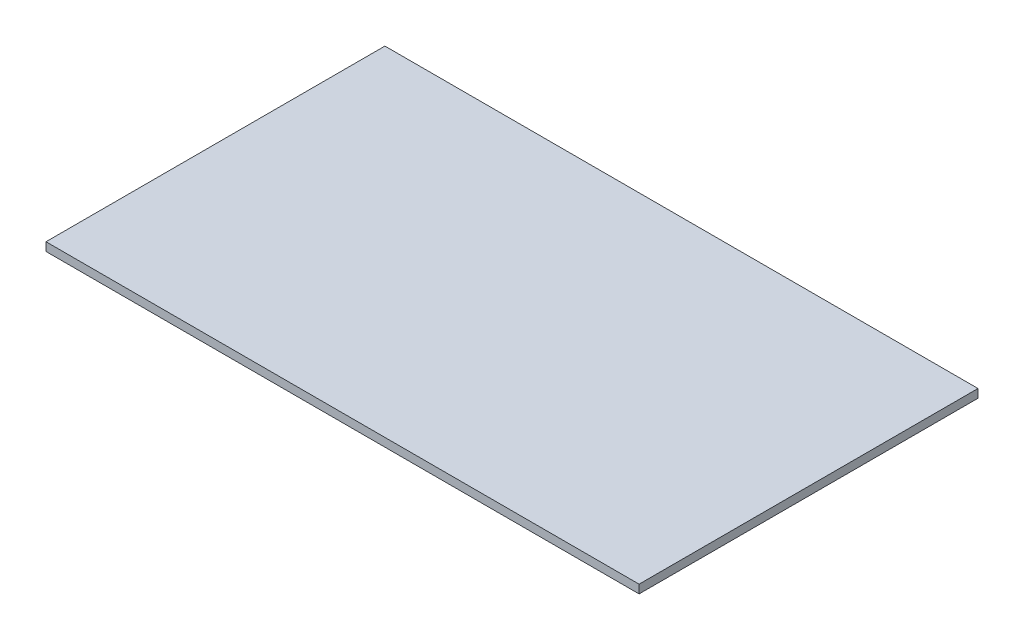
ISO-10303-21;
HEADER;
FILE_DESCRIPTION(('STEP AP214'),'2;1');
FILE_NAME('part.step','',(''),(''),'','','');
FILE_SCHEMA(('AUTOMOTIVE_DESIGN { 1 0 10303 214 1 1 1 1 }'));
ENDSEC;
DATA;
#1=APPLICATION_CONTEXT('core data for automotive mechanical design processes');
#2=APPLICATION_PROTOCOL_DEFINITION('international standard','automotive_design',2000,#1);
#3=PRODUCT_CONTEXT('',#1,'mechanical');
#4=PRODUCT('Part','Part','',(#3));
#5=PRODUCT_RELATED_PRODUCT_CATEGORY('part','',(#4));
#6=PRODUCT_DEFINITION_FORMATION('','',#4);
#7=PRODUCT_DEFINITION_CONTEXT('part definition',#1,'design');
#8=PRODUCT_DEFINITION('design','',#6,#7);
#9=PRODUCT_DEFINITION_SHAPE('','',#8);
#10=(LENGTH_UNIT() NAMED_UNIT(*) SI_UNIT(.MILLI.,.METRE.));
#11=(NAMED_UNIT(*) PLANE_ANGLE_UNIT() SI_UNIT($,.RADIAN.));
#12=(NAMED_UNIT(*) SI_UNIT($,.STERADIAN.) SOLID_ANGLE_UNIT());
#13=UNCERTAINTY_MEASURE_WITH_UNIT(LENGTH_MEASURE(1.E-05),#10,'distance_accuracy_value','');
#14=(GEOMETRIC_REPRESENTATION_CONTEXT(3) GLOBAL_UNCERTAINTY_ASSIGNED_CONTEXT((#13)) GLOBAL_UNIT_ASSIGNED_CONTEXT((#10,
#11,#12)) REPRESENTATION_CONTEXT('',''));
#15=CARTESIAN_POINT('',(0.,0.,0.));
#16=DIRECTION('',(0.,0.,1.));
#17=DIRECTION('',(1.,0.,0.));
#18=AXIS2_PLACEMENT_3D('',#15,#16,#17);
#19=CARTESIAN_POINT('',(-175.,5.,-100.));
#20=DIRECTION('',(1.,0.,0.));
#21=DIRECTION('',(0.,0.,-1.));
#22=AXIS2_PLACEMENT_3D('',#19,#20,#21);
#23=PLANE('',#22);
#24=DIRECTION('',(0.,0.,1.));
#25=VECTOR('',#24,1.);
#26=CARTESIAN_POINT('',(-175.,0.,-100.));
#27=LINE('',#26,#25);
#28=CARTESIAN_POINT('',(-175.,0.,-100.));
#29=VERTEX_POINT('',#28);
#30=CARTESIAN_POINT('',(-175.,0.,100.));
#31=VERTEX_POINT('',#30);
#32=EDGE_CURVE('E96',#29,#31,#27,.T.);
#33=ORIENTED_EDGE('',*,*,#32,.T.);
#34=DIRECTION('',(0.,-1.,0.));
#35=VECTOR('',#34,1.);
#36=CARTESIAN_POINT('',(-175.,5.,100.));
#37=LINE('',#36,#35);
#38=CARTESIAN_POINT('',(-175.,5.,100.));
#39=VERTEX_POINT('',#38);
#40=EDGE_CURVE('E11',#39,#31,#37,.T.);
#41=ORIENTED_EDGE('',*,*,#40,.F.);
#42=DIRECTION('',(0.,0.,1.));
#43=VECTOR('',#42,1.);
#44=CARTESIAN_POINT('',(-175.,5.,-100.));
#45=LINE('',#44,#43);
#46=CARTESIAN_POINT('',(-175.,5.,-100.));
#47=VERTEX_POINT('',#46);
#48=EDGE_CURVE('E84',#47,#39,#45,.T.);
#49=ORIENTED_EDGE('',*,*,#48,.F.);
#50=DIRECTION('',(0.,-1.,0.));
#51=VECTOR('',#50,1.);
#52=CARTESIAN_POINT('',(-175.,5.,-100.));
#53=LINE('',#52,#51);
#54=EDGE_CURVE('E92',#47,#29,#53,.T.);
#55=ORIENTED_EDGE('',*,*,#54,.T.);
#56=EDGE_LOOP('',(#33,#41,#49,#55));
#57=FACE_BOUND('',#56,.T.);
#58=ADVANCED_FACE('F33',(#57),#23,.F.);
#59=CARTESIAN_POINT('',(-175.,5.,100.));
#60=DIRECTION('',(0.,0.,-1.));
#61=DIRECTION('',(-1.,0.,0.));
#62=AXIS2_PLACEMENT_3D('',#59,#60,#61);
#63=PLANE('',#62);
#64=DIRECTION('',(1.,0.,0.));
#65=VECTOR('',#64,1.);
#66=CARTESIAN_POINT('',(-175.,0.,100.));
#67=LINE('',#66,#65);
#68=CARTESIAN_POINT('',(175.,0.,100.));
#69=VERTEX_POINT('',#68);
#70=EDGE_CURVE('E88',#31,#69,#67,.T.);
#71=ORIENTED_EDGE('',*,*,#70,.T.);
#72=DIRECTION('',(0.,-1.,0.));
#73=VECTOR('',#72,1.);
#74=CARTESIAN_POINT('',(175.,5.,100.));
#75=LINE('',#74,#73);
#76=CARTESIAN_POINT('',(175.,5.,100.));
#77=VERTEX_POINT('',#76);
#78=EDGE_CURVE('E41',#77,#69,#75,.T.);
#79=ORIENTED_EDGE('',*,*,#78,.F.);
#80=DIRECTION('',(1.,0.,0.));
#81=VECTOR('',#80,1.);
#82=CARTESIAN_POINT('',(-175.,5.,100.));
#83=LINE('',#82,#81);
#84=EDGE_CURVE('E79',#39,#77,#83,.T.);
#85=ORIENTED_EDGE('',*,*,#84,.F.);
#86=ORIENTED_EDGE('',*,*,#40,.T.);
#87=EDGE_LOOP('',(#71,#79,#85,#86));
#88=FACE_BOUND('',#87,.T.);
#89=ADVANCED_FACE('F87',(#88),#63,.F.);
#90=CARTESIAN_POINT('',(175.,5.,-100.));
#91=DIRECTION('',(-1.,0.,0.));
#92=DIRECTION('',(0.,0.,1.));
#93=AXIS2_PLACEMENT_3D('',#90,#91,#92);
#94=PLANE('',#93);
#95=DIRECTION('',(0.,0.,-1.));
#96=VECTOR('',#95,1.);
#97=CARTESIAN_POINT('',(175.,0.,-100.));
#98=LINE('',#97,#96);
#99=CARTESIAN_POINT('',(175.,0.,-100.));
#100=VERTEX_POINT('',#99);
#101=EDGE_CURVE('E66',#69,#100,#98,.T.);
#102=ORIENTED_EDGE('',*,*,#101,.T.);
#103=DIRECTION('',(0.,-1.,0.));
#104=VECTOR('',#103,1.);
#105=CARTESIAN_POINT('',(175.,5.,-100.));
#106=LINE('',#105,#104);
#107=CARTESIAN_POINT('',(175.,5.,-100.));
#108=VERTEX_POINT('',#107);
#109=EDGE_CURVE('E89',#108,#100,#106,.T.);
#110=ORIENTED_EDGE('',*,*,#109,.F.);
#111=DIRECTION('',(0.,0.,-1.));
#112=VECTOR('',#111,1.);
#113=CARTESIAN_POINT('',(175.,5.,-100.));
#114=LINE('',#113,#112);
#115=EDGE_CURVE('E82',#77,#108,#114,.T.);
#116=ORIENTED_EDGE('',*,*,#115,.F.);
#117=ORIENTED_EDGE('',*,*,#78,.T.);
#118=EDGE_LOOP('',(#102,#110,#116,#117));
#119=FACE_BOUND('',#118,.T.);
#120=ADVANCED_FACE('F90',(#119),#94,.F.);
#121=CARTESIAN_POINT('',(-175.,5.,-100.));
#122=DIRECTION('',(0.,0.,1.));
#123=DIRECTION('',(1.,0.,0.));
#124=AXIS2_PLACEMENT_3D('',#121,#122,#123);
#125=PLANE('',#124);
#126=DIRECTION('',(-1.,0.,0.));
#127=VECTOR('',#126,1.);
#128=CARTESIAN_POINT('',(-175.,0.,-100.));
#129=LINE('',#128,#127);
#130=EDGE_CURVE('E72',#100,#29,#129,.T.);
#131=ORIENTED_EDGE('',*,*,#130,.T.);
#132=ORIENTED_EDGE('',*,*,#54,.F.);
#133=DIRECTION('',(-1.,0.,0.));
#134=VECTOR('',#133,1.);
#135=CARTESIAN_POINT('',(-175.,5.,-100.));
#136=LINE('',#135,#134);
#137=EDGE_CURVE('E49',#108,#47,#136,.T.);
#138=ORIENTED_EDGE('',*,*,#137,.F.);
#139=ORIENTED_EDGE('',*,*,#109,.T.);
#140=EDGE_LOOP('',(#131,#132,#138,#139));
#141=FACE_BOUND('',#140,.T.);
#142=ADVANCED_FACE('F103',(#141),#125,.F.);
#143=CARTESIAN_POINT('',(0.,5.,0.));
#144=DIRECTION('',(0.,1.,0.));
#145=DIRECTION('',(0.,0.,1.));
#146=AXIS2_PLACEMENT_3D('',#143,#144,#145);
#147=PLANE('',#146);
#148=ORIENTED_EDGE('',*,*,#48,.T.);
#149=ORIENTED_EDGE('',*,*,#84,.T.);
#150=ORIENTED_EDGE('',*,*,#115,.T.);
#151=ORIENTED_EDGE('',*,*,#137,.T.);
#152=EDGE_LOOP('',(#148,#149,#150,#151));
#153=FACE_BOUND('',#152,.T.);
#154=ADVANCED_FACE('F80',(#153),#147,.T.);
#155=CARTESIAN_POINT('',(0.,0.,0.));
#156=DIRECTION('',(0.,1.,0.));
#157=DIRECTION('',(0.,0.,1.));
#158=AXIS2_PLACEMENT_3D('',#155,#156,#157);
#159=PLANE('',#158);
#160=ORIENTED_EDGE('',*,*,#32,.F.);
#161=ORIENTED_EDGE('',*,*,#130,.F.);
#162=ORIENTED_EDGE('',*,*,#101,.F.);
#163=ORIENTED_EDGE('',*,*,#70,.F.);
#164=EDGE_LOOP('',(#160,#161,#162,#163));
#165=FACE_BOUND('',#164,.T.);
#166=ADVANCED_FACE('F106',(#165),#159,.F.);
#167=CLOSED_SHELL('',(#58,#89,#120,#142,#154,#166));
#168=MANIFOLD_SOLID_BREP('B2',#167);
#169=ADVANCED_BREP_SHAPE_REPRESENTATION('',(#18,#168),#14);
#170=SHAPE_DEFINITION_REPRESENTATION(#9,#169);
ENDSEC;
END-ISO-10303-21;
